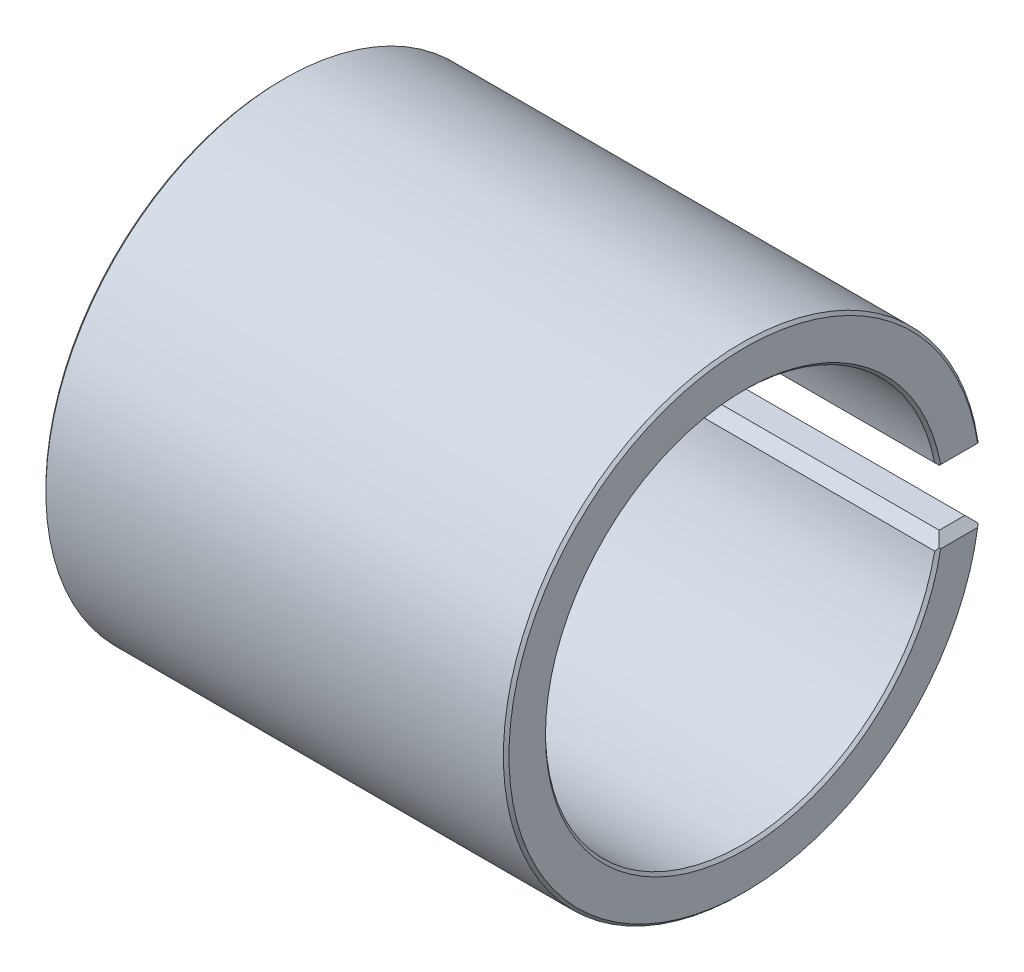
ISO-10303-21;
HEADER;
FILE_DESCRIPTION(('STEP AP214'),'2;1');
FILE_NAME('part.step','',(''),(''),'','','');
FILE_SCHEMA(('AUTOMOTIVE_DESIGN { 1 0 10303 214 1 1 1 1 }'));
ENDSEC;
DATA;
#1=APPLICATION_CONTEXT('core data for automotive mechanical design processes');
#2=APPLICATION_PROTOCOL_DEFINITION('international standard','automotive_design',2000,#1);
#3=PRODUCT_CONTEXT('',#1,'mechanical');
#4=PRODUCT('Part','Part','',(#3));
#5=PRODUCT_RELATED_PRODUCT_CATEGORY('part','',(#4));
#6=PRODUCT_DEFINITION_FORMATION('','',#4);
#7=PRODUCT_DEFINITION_CONTEXT('part definition',#1,'design');
#8=PRODUCT_DEFINITION('design','',#6,#7);
#9=PRODUCT_DEFINITION_SHAPE('','',#8);
#10=(LENGTH_UNIT() NAMED_UNIT(*) SI_UNIT(.MILLI.,.METRE.));
#11=(NAMED_UNIT(*) PLANE_ANGLE_UNIT() SI_UNIT($,.RADIAN.));
#12=(NAMED_UNIT(*) SI_UNIT($,.STERADIAN.) SOLID_ANGLE_UNIT());
#13=UNCERTAINTY_MEASURE_WITH_UNIT(LENGTH_MEASURE(1.E-05),#10,'distance_accuracy_value','');
#14=(GEOMETRIC_REPRESENTATION_CONTEXT(3) GLOBAL_UNCERTAINTY_ASSIGNED_CONTEXT((#13)) GLOBAL_UNIT_ASSIGNED_CONTEXT((#10,
#11,#12)) REPRESENTATION_CONTEXT('',''));
#15=CARTESIAN_POINT('',(0.,0.,0.));
#16=DIRECTION('',(0.,0.,1.));
#17=DIRECTION('',(1.,0.,0.));
#18=AXIS2_PLACEMENT_3D('',#15,#16,#17);
#19=CARTESIAN_POINT('',(-8.25,7.,0.));
#20=DIRECTION('',(1.,0.,0.));
#21=DIRECTION('',(0.,0.,-1.));
#22=AXIS2_PLACEMENT_3D('',#19,#20,#21);
#23=PLANE('',#22);
#24=CARTESIAN_POINT('',(-8.25,0.,0.));
#25=DIRECTION('',(1.,0.,0.));
#26=DIRECTION('',(0.,0.,-1.));
#27=AXIS2_PLACEMENT_3D('',#24,#25,#26);
#28=CIRCLE('',#27,8.4);
#29=CARTESIAN_POINT('',(-8.25,-1.3,-8.29879509326504));
#30=VERTEX_POINT('',#29);
#31=CARTESIAN_POINT('',(-8.25,1.3,-8.29879509326504));
#32=VERTEX_POINT('',#31);
#33=EDGE_CURVE('E435',#30,#32,#28,.F.);
#34=ORIENTED_EDGE('',*,*,#33,.T.);
#35=DIRECTION('',(0.,0.,1.));
#36=VECTOR('',#35,1.);
#37=CARTESIAN_POINT('',(-8.25,1.3,0.));
#38=LINE('',#37,#36);
#39=CARTESIAN_POINT('',(-8.25,1.3,-6.97997134664607));
#40=VERTEX_POINT('',#39);
#41=EDGE_CURVE('E11',#32,#40,#38,.T.);
#42=ORIENTED_EDGE('',*,*,#41,.T.);
#43=CARTESIAN_POINT('',(-8.25,0.,0.));
#44=DIRECTION('',(1.,0.,0.));
#45=DIRECTION('',(0.,0.,-1.));
#46=AXIS2_PLACEMENT_3D('',#43,#44,#45);
#47=CIRCLE('',#46,7.10000000000001);
#48=CARTESIAN_POINT('',(-8.25,-1.3,-6.97997134664607));
#49=VERTEX_POINT('',#48);
#50=EDGE_CURVE('E382',#40,#49,#47,.T.);
#51=ORIENTED_EDGE('',*,*,#50,.T.);
#52=DIRECTION('',(0.,0.,-1.));
#53=VECTOR('',#52,1.);
#54=CARTESIAN_POINT('',(-8.25,-1.3,0.));
#55=LINE('',#54,#53);
#56=EDGE_CURVE('E56',#49,#30,#55,.T.);
#57=ORIENTED_EDGE('',*,*,#56,.T.);
#58=EDGE_LOOP('',(#34,#42,#51,#57));
#59=FACE_BOUND('',#58,.T.);
#60=ADVANCED_FACE('F45',(#59),#23,.F.);
#61=CARTESIAN_POINT('',(0.,0.,0.));
#62=DIRECTION('',(-1.,0.,0.));
#63=DIRECTION('',(0.,0.,1.));
#64=AXIS2_PLACEMENT_3D('',#61,#62,#63);
#65=CYLINDRICAL_SURFACE('',#64,8.5);
#66=CARTESIAN_POINT('',(-8.15,0.,0.));
#67=DIRECTION('',(1.,0.,0.));
#68=DIRECTION('',(0.,0.,-1.));
#69=AXIS2_PLACEMENT_3D('',#66,#67,#68);
#70=CIRCLE('',#69,8.5);
#71=CARTESIAN_POINT('',(-8.15,1.26445286814602,-8.40542437621309));
#72=VERTEX_POINT('',#71);
#73=CARTESIAN_POINT('',(-8.15,-1.26445286814602,-8.40542437621309));
#74=VERTEX_POINT('',#73);
#75=EDGE_CURVE('E191',#72,#74,#70,.T.);
#76=ORIENTED_EDGE('',*,*,#75,.T.);
#77=DIRECTION('',(-1.,0.,0.));
#78=VECTOR('',#77,1.);
#79=CARTESIAN_POINT('',(0.,-1.26445286814602,-8.40542437621309));
#80=LINE('',#79,#78);
#81=CARTESIAN_POINT('',(8.15,-1.26445286814602,-8.40542437621309));
#82=VERTEX_POINT('',#81);
#83=EDGE_CURVE('E250',#74,#82,#80,.F.);
#84=ORIENTED_EDGE('',*,*,#83,.T.);
#85=CARTESIAN_POINT('',(8.15,0.,0.));
#86=DIRECTION('',(-1.,0.,0.));
#87=DIRECTION('',(0.,0.,1.));
#88=AXIS2_PLACEMENT_3D('',#85,#86,#87);
#89=CIRCLE('',#88,8.5);
#90=CARTESIAN_POINT('',(8.15,1.26445286814602,-8.40542437621309));
#91=VERTEX_POINT('',#90);
#92=EDGE_CURVE('E196',#82,#91,#89,.T.);
#93=ORIENTED_EDGE('',*,*,#92,.T.);
#94=DIRECTION('',(-1.,0.,0.));
#95=VECTOR('',#94,1.);
#96=CARTESIAN_POINT('',(0.,1.26445286814602,-8.40542437621309));
#97=LINE('',#96,#95);
#98=EDGE_CURVE('E399',#91,#72,#97,.T.);
#99=ORIENTED_EDGE('',*,*,#98,.T.);
#100=EDGE_LOOP('',(#76,#84,#93,#99));
#101=FACE_BOUND('',#100,.T.);
#102=ADVANCED_FACE('F431',(#101),#65,.T.);
#103=CARTESIAN_POINT('',(8.25,8.5,0.));
#104=DIRECTION('',(-1.,0.,0.));
#105=DIRECTION('',(0.,0.,1.));
#106=AXIS2_PLACEMENT_3D('',#103,#104,#105);
#107=PLANE('',#106);
#108=CARTESIAN_POINT('',(8.25,0.,0.));
#109=DIRECTION('',(-1.,0.,0.));
#110=DIRECTION('',(0.,0.,1.));
#111=AXIS2_PLACEMENT_3D('',#108,#109,#110);
#112=CIRCLE('',#111,7.1);
#113=CARTESIAN_POINT('',(8.25,-1.3,-6.97997134664606));
#114=VERTEX_POINT('',#113);
#115=CARTESIAN_POINT('',(8.25,1.3,-6.97997134664606));
#116=VERTEX_POINT('',#115);
#117=EDGE_CURVE('E186',#114,#116,#112,.T.);
#118=ORIENTED_EDGE('',*,*,#117,.T.);
#119=DIRECTION('',(0.,0.,-1.));
#120=VECTOR('',#119,1.);
#121=CARTESIAN_POINT('',(8.25,1.3,0.));
#122=LINE('',#121,#120);
#123=CARTESIAN_POINT('',(8.25,1.3,-8.29879509326505));
#124=VERTEX_POINT('',#123);
#125=EDGE_CURVE('E403',#116,#124,#122,.T.);
#126=ORIENTED_EDGE('',*,*,#125,.T.);
#127=CARTESIAN_POINT('',(8.25,0.,0.));
#128=DIRECTION('',(-1.,0.,0.));
#129=DIRECTION('',(0.,0.,1.));
#130=AXIS2_PLACEMENT_3D('',#127,#128,#129);
#131=CIRCLE('',#130,8.4);
#132=CARTESIAN_POINT('',(8.25,-1.3,-8.29879509326505));
#133=VERTEX_POINT('',#132);
#134=EDGE_CURVE('E193',#124,#133,#131,.F.);
#135=ORIENTED_EDGE('',*,*,#134,.T.);
#136=DIRECTION('',(0.,0.,1.));
#137=VECTOR('',#136,1.);
#138=CARTESIAN_POINT('',(8.25,-1.3,0.));
#139=LINE('',#138,#137);
#140=EDGE_CURVE('E407',#133,#114,#139,.T.);
#141=ORIENTED_EDGE('',*,*,#140,.T.);
#142=EDGE_LOOP('',(#118,#126,#135,#141));
#143=FACE_BOUND('',#142,.T.);
#144=ADVANCED_FACE('F441',(#143),#107,.F.);
#145=CARTESIAN_POINT('',(0.,0.,0.));
#146=DIRECTION('',(-1.,0.,0.));
#147=DIRECTION('',(0.,0.,1.));
#148=AXIS2_PLACEMENT_3D('',#145,#146,#147);
#149=CYLINDRICAL_SURFACE('',#148,7.);
#150=CARTESIAN_POINT('',(8.15,0.,0.));
#151=DIRECTION('',(-1.,0.,0.));
#152=DIRECTION('',(0.,0.,1.));
#153=AXIS2_PLACEMENT_3D('',#150,#151,#152);
#154=CIRCLE('',#153,7.);
#155=CARTESIAN_POINT('',(8.15,1.3619809963565,-6.86622223391901));
#156=VERTEX_POINT('',#155);
#157=CARTESIAN_POINT('',(8.15,-1.3619809963565,-6.86622223391901));
#158=VERTEX_POINT('',#157);
#159=EDGE_CURVE('E181',#156,#158,#154,.F.);
#160=ORIENTED_EDGE('',*,*,#159,.T.);
#161=DIRECTION('',(-1.,0.,0.));
#162=VECTOR('',#161,1.);
#163=CARTESIAN_POINT('',(0.,-1.3619809963565,-6.86622223391901));
#164=LINE('',#163,#162);
#165=CARTESIAN_POINT('',(-8.15,-1.3619809963565,-6.86622223391901));
#166=VERTEX_POINT('',#165);
#167=EDGE_CURVE('E185',#158,#166,#164,.T.);
#168=ORIENTED_EDGE('',*,*,#167,.T.);
#169=CARTESIAN_POINT('',(-8.15,0.,0.));
#170=DIRECTION('',(1.,0.,0.));
#171=DIRECTION('',(0.,0.,-1.));
#172=AXIS2_PLACEMENT_3D('',#169,#170,#171);
#173=CIRCLE('',#172,7.);
#174=CARTESIAN_POINT('',(-8.15,1.3619809963565,-6.86622223391901));
#175=VERTEX_POINT('',#174);
#176=EDGE_CURVE('E184',#166,#175,#173,.F.);
#177=ORIENTED_EDGE('',*,*,#176,.T.);
#178=DIRECTION('',(-1.,0.,0.));
#179=VECTOR('',#178,1.);
#180=CARTESIAN_POINT('',(0.,1.3619809963565,-6.86622223391901));
#181=LINE('',#180,#179);
#182=EDGE_CURVE('E166',#175,#156,#181,.F.);
#183=ORIENTED_EDGE('',*,*,#182,.T.);
#184=EDGE_LOOP('',(#160,#168,#177,#183));
#185=FACE_BOUND('',#184,.T.);
#186=ADVANCED_FACE('F179',(#185),#149,.F.);
#187=CARTESIAN_POINT('',(-8.25,0.,0.));
#188=DIRECTION('',(1.,0.,0.));
#189=DIRECTION('',(0.,0.,-1.));
#190=AXIS2_PLACEMENT_3D('',#187,#188,#189);
#191=CONICAL_SURFACE('',#190,8.4,0.785398163397457);
#192=ORIENTED_EDGE('',*,*,#75,.F.);
#193=CARTESIAN_POINT('',(-8.15,1.26445286814602,-8.40542437621309));
#194=CARTESIAN_POINT('',(-8.1667000097545,1.2497735971975,-8.39074510526457));
#195=CARTESIAN_POINT('',(-8.18338334793342,1.23508487406916,-8.37605638213623));
#196=CARTESIAN_POINT('',(-8.21671668126701,1.20568852334098,-8.34666003140805));
#197=CARTESIAN_POINT('',(-8.23336667642142,1.19098089574098,-8.33195240380805));
#198=CARTESIAN_POINT('',(-8.25,1.17626381596103,-8.3172353240281));
#199=B_SPLINE_CURVE_WITH_KNOTS('',3,(#193,#194,#195,#196,#197,#198),.UNSPECIFIED.,.F.,.F.,(4,2,
4),(0.,0.0799290843414844,0.159858169291451),.UNSPECIFIED.);
#200=CARTESIAN_POINT('',(-8.18428360096254,1.23428360096254,-8.37525510902961));
#201=VERTEX_POINT('',#200);
#202=EDGE_CURVE('E64',#72,#201,#199,.T.);
#203=ORIENTED_EDGE('',*,*,#202,.T.);
#204=CARTESIAN_POINT('',(-8.15,1.2,-8.41486779456457));
#205=CARTESIAN_POINT('',(-8.16671325425253,1.21671325425253,-8.39560261828659));
#206=CARTESIAN_POINT('',(-8.18340321456955,1.23340321456955,-8.37629730520597));
#207=CARTESIAN_POINT('',(-8.21673654790448,1.26673654790448,-8.33760640477555));
#208=CARTESIAN_POINT('',(-8.2333799209208,1.2833799209208,-8.318220817423));
#209=CARTESIAN_POINT('',(-8.25,1.3,-8.29879509326504));
#210=B_SPLINE_CURVE_WITH_KNOTS('',3,(#204,#205,#206,#207,#208,#209),.UNSPECIFIED.,.F.,.F.,(4,2,
4),(0.,0.0914780956031036,0.182956194345469),.UNSPECIFIED.);
#211=EDGE_CURVE('E274',#201,#32,#210,.T.);
#212=ORIENTED_EDGE('',*,*,#211,.T.);
#213=ORIENTED_EDGE('',*,*,#33,.F.);
#214=CARTESIAN_POINT('',(-8.25,-1.3,-8.29879509326504));
#215=CARTESIAN_POINT('',(-8.2333799209208,-1.2833799209208,-8.318220817423));
#216=CARTESIAN_POINT('',(-8.21673654790448,-1.26673654790448,-8.33760640477555));
#217=CARTESIAN_POINT('',(-8.18340321456955,-1.23340321456954,-8.37629730520597));
#218=CARTESIAN_POINT('',(-8.16671325425253,-1.21671325425253,-8.39560261828659));
#219=CARTESIAN_POINT('',(-8.15,-1.2,-8.41486779456457));
#220=B_SPLINE_CURVE_WITH_KNOTS('',3,(#214,#215,#216,#217,#218,#219),.UNSPECIFIED.,.F.,.F.,(4,2,
4),(0.,0.0914780987423646,0.182956194345468),.UNSPECIFIED.);
#221=CARTESIAN_POINT('',(-8.18428360096254,-1.23428360096254,-8.37525510902961));
#222=VERTEX_POINT('',#221);
#223=EDGE_CURVE('E71',#30,#222,#220,.T.);
#224=ORIENTED_EDGE('',*,*,#223,.T.);
#225=CARTESIAN_POINT('',(-8.25,-1.17626381596103,-8.3172353240281));
#226=CARTESIAN_POINT('',(-8.23336667642142,-1.19098089574098,-8.33195240380805));
#227=CARTESIAN_POINT('',(-8.21671668126701,-1.20568852334097,-8.34666003140804));
#228=CARTESIAN_POINT('',(-8.18338334793342,-1.23508487406916,-8.37605638213623));
#229=CARTESIAN_POINT('',(-8.1667000097545,-1.2497735971975,-8.39074510526457));
#230=CARTESIAN_POINT('',(-8.15,-1.26445286814602,-8.40542437621309));
#231=B_SPLINE_CURVE_WITH_KNOTS('',3,(#225,#226,#227,#228,#229,#230),.UNSPECIFIED.,.F.,.F.,(4,2,
4),(0.,0.0799290849499674,0.159858169291453),.UNSPECIFIED.);
#232=EDGE_CURVE('E249',#222,#74,#231,.T.);
#233=ORIENTED_EDGE('',*,*,#232,.T.);
#234=EDGE_LOOP('',(#192,#203,#212,#213,#224,#233));
#235=FACE_BOUND('',#234,.T.);
#236=ADVANCED_FACE('F258',(#235),#191,.T.);
#237=CARTESIAN_POINT('',(-8.15,0.,0.));
#238=DIRECTION('',(-1.,0.,0.));
#239=DIRECTION('',(0.,0.,1.));
#240=AXIS2_PLACEMENT_3D('',#237,#238,#239);
#241=CONICAL_SURFACE('',#240,7.,0.78539816339747);
#242=CARTESIAN_POINT('',(-8.25,1.3,-6.97997134664607));
#243=CARTESIAN_POINT('',(-8.23330733513689,1.28330733513689,-6.96610096617401));
#244=CARTESIAN_POINT('',(-8.21662766947473,1.26662766947473,-6.9521994854561));
#245=CARTESIAN_POINT('',(-8.18329433614076,1.23329433614076,-6.9243343231845));
#246=CARTESIAN_POINT('',(-8.16664066846958,1.21664066846958,-6.91037064162928));
#247=CARTESIAN_POINT('',(-8.15,1.2,-6.89637585982667));
#248=B_SPLINE_CURVE_WITH_KNOTS('',3,(#242,#243,#244,#245,#246,#247),.UNSPECIFIED.,.F.,.F.,(4,2,
4),(0.,0.082140507267581,0.164281016563663),.UNSPECIFIED.);
#249=CARTESIAN_POINT('',(-8.22174770880733,1.27174770880733,-6.95645552146818));
#250=VERTEX_POINT('',#249);
#251=EDGE_CURVE('E292',#40,#250,#248,.T.);
#252=ORIENTED_EDGE('',*,*,#251,.T.);
#253=CARTESIAN_POINT('',(-8.25,1.23674729209706,-6.99145593817845));
#254=CARTESIAN_POINT('',(-8.23314182203366,1.25754311252099,-6.97066011775452));
#255=CARTESIAN_POINT('',(-8.216379400332,1.27837716397278,-6.94982606630273));
#256=CARTESIAN_POINT('',(-8.18304606697007,1.32012173204784,-6.90808149822766));
#257=CARTESIAN_POINT('',(-8.1664751553384,1.34103224868253,-6.88717098159298));
#258=CARTESIAN_POINT('',(-8.15,1.3619809963565,-6.86622223391901));
#259=B_SPLINE_CURVE_WITH_KNOTS('',3,(#253,#254,#255,#256,#257,#258),.UNSPECIFIED.,.F.,.F.,(4,2,
4),(0.,0.101694875140613,0.20338976546198),.UNSPECIFIED.);
#260=EDGE_CURVE('E298',#250,#175,#259,.T.);
#261=ORIENTED_EDGE('',*,*,#260,.T.);
#262=ORIENTED_EDGE('',*,*,#176,.F.);
#263=CARTESIAN_POINT('',(-8.15,-1.3619809963565,-6.86622223391901));
#264=CARTESIAN_POINT('',(-8.1664751553384,-1.34103224868253,-6.88717098159298));
#265=CARTESIAN_POINT('',(-8.18304606697007,-1.32012173204784,-6.90808149822766));
#266=CARTESIAN_POINT('',(-8.216379400332,-1.27837716397278,-6.94982606630273));
#267=CARTESIAN_POINT('',(-8.23314182203366,-1.25754311252099,-6.97066011775452));
#268=CARTESIAN_POINT('',(-8.25,-1.23674729209706,-6.99145593817845));
#269=B_SPLINE_CURVE_WITH_KNOTS('',3,(#263,#264,#265,#266,#267,#268),.UNSPECIFIED.,.F.,.F.,(4,2,
4),(0.,0.101694890321367,0.20338976546198),.UNSPECIFIED.);
#270=CARTESIAN_POINT('',(-8.22174770880733,-1.27174770880733,-6.95645552146818));
#271=VERTEX_POINT('',#270);
#272=EDGE_CURVE('E213',#166,#271,#269,.T.);
#273=ORIENTED_EDGE('',*,*,#272,.T.);
#274=CARTESIAN_POINT('',(-8.15,-1.2,-6.89637585982667));
#275=CARTESIAN_POINT('',(-8.16664066846958,-1.21664066846958,-6.91037064162928));
#276=CARTESIAN_POINT('',(-8.18329433614076,-1.23329433614076,-6.9243343231845));
#277=CARTESIAN_POINT('',(-8.21662766947473,-1.26662766947473,-6.9521994854561));
#278=CARTESIAN_POINT('',(-8.23330733513689,-1.28330733513689,-6.96610096617401));
#279=CARTESIAN_POINT('',(-8.25,-1.3,-6.97997134664607));
#280=B_SPLINE_CURVE_WITH_KNOTS('',3,(#274,#275,#276,#277,#278,#279),.UNSPECIFIED.,.F.,.F.,(4,2,
4),(0.,0.0821405092960821,0.164281016563663),.UNSPECIFIED.);
#281=EDGE_CURVE('E205',#271,#49,#280,.T.);
#282=ORIENTED_EDGE('',*,*,#281,.T.);
#283=ORIENTED_EDGE('',*,*,#50,.F.);
#284=EDGE_LOOP('',(#252,#261,#262,#273,#282,#283));
#285=FACE_BOUND('',#284,.T.);
#286=ADVANCED_FACE('F221',(#285),#241,.F.);
#287=CARTESIAN_POINT('',(8.25,0.,0.));
#288=DIRECTION('',(1.,0.,0.));
#289=DIRECTION('',(0.,0.,-1.));
#290=AXIS2_PLACEMENT_3D('',#287,#288,#289);
#291=CONICAL_SURFACE('',#290,7.1,0.785398163397457);
#292=ORIENTED_EDGE('',*,*,#159,.F.);
#293=CARTESIAN_POINT('',(8.15,1.3619809963565,-6.86622223391901));
#294=CARTESIAN_POINT('',(8.1664751553384,1.34103224868253,-6.88717098159298));
#295=CARTESIAN_POINT('',(8.18304606697007,1.32012173204785,-6.90808149822766));
#296=CARTESIAN_POINT('',(8.216379400332,1.27837716397278,-6.94982606630273));
#297=CARTESIAN_POINT('',(8.23314182203366,1.25754311252099,-6.97066011775452));
#298=CARTESIAN_POINT('',(8.25,1.23674729209706,-6.99145593817845));
#299=B_SPLINE_CURVE_WITH_KNOTS('',3,(#293,#294,#295,#296,#297,#298),.UNSPECIFIED.,.F.,.F.,(4,2,
4),(0.,0.101694890321363,0.203389765461973),.UNSPECIFIED.);
#300=CARTESIAN_POINT('',(8.22174770880733,1.27174770880733,-6.95645552146818));
#301=VERTEX_POINT('',#300);
#302=EDGE_CURVE('E162',#156,#301,#299,.T.);
#303=ORIENTED_EDGE('',*,*,#302,.T.);
#304=CARTESIAN_POINT('',(8.15,1.2,-6.89637585982667));
#305=CARTESIAN_POINT('',(8.16664066846958,1.21664066846958,-6.91037064162928));
#306=CARTESIAN_POINT('',(8.18329433614076,1.23329433614076,-6.9243343231845));
#307=CARTESIAN_POINT('',(8.21662766947473,1.26662766947473,-6.95219948545609));
#308=CARTESIAN_POINT('',(8.23330733513689,1.28330733513689,-6.966100966174));
#309=CARTESIAN_POINT('',(8.25,1.3,-6.97997134664606));
#310=B_SPLINE_CURVE_WITH_KNOTS('',3,(#304,#305,#306,#307,#308,#309),.UNSPECIFIED.,.F.,.F.,(4,2,
4),(0.,0.0821405092960786,0.164281016563658),.UNSPECIFIED.);
#311=EDGE_CURVE('E174',#301,#116,#310,.T.);
#312=ORIENTED_EDGE('',*,*,#311,.T.);
#313=ORIENTED_EDGE('',*,*,#117,.F.);
#314=CARTESIAN_POINT('',(8.25,-1.3,-6.97997134664606));
#315=CARTESIAN_POINT('',(8.23330733513689,-1.28330733513689,-6.966100966174));
#316=CARTESIAN_POINT('',(8.21662766947474,-1.26662766947473,-6.95219948545609));
#317=CARTESIAN_POINT('',(8.18329433614076,-1.23329433614076,-6.9243343231845));
#318=CARTESIAN_POINT('',(8.16664066846958,-1.21664066846958,-6.91037064162928));
#319=CARTESIAN_POINT('',(8.15,-1.2,-6.89637585982667));
#320=B_SPLINE_CURVE_WITH_KNOTS('',3,(#314,#315,#316,#317,#318,#319),.UNSPECIFIED.,.F.,.F.,(4,2,
4),(0.,0.082140507267578,0.164281016563658),.UNSPECIFIED.);
#321=CARTESIAN_POINT('',(8.22174770880733,-1.27174770880733,-6.95645552146818));
#322=VERTEX_POINT('',#321);
#323=EDGE_CURVE('E339',#114,#322,#320,.T.);
#324=ORIENTED_EDGE('',*,*,#323,.T.);
#325=CARTESIAN_POINT('',(8.25,-1.23674729209706,-6.99145593817845));
#326=CARTESIAN_POINT('',(8.23314182203366,-1.25754311252099,-6.97066011775452));
#327=CARTESIAN_POINT('',(8.216379400332,-1.27837716397278,-6.94982606630273));
#328=CARTESIAN_POINT('',(8.18304606697007,-1.32012173204785,-6.90808149822766));
#329=CARTESIAN_POINT('',(8.1664751553384,-1.34103224868253,-6.88717098159298));
#330=CARTESIAN_POINT('',(8.15,-1.3619809963565,-6.86622223391901));
#331=B_SPLINE_CURVE_WITH_KNOTS('',3,(#325,#326,#327,#328,#329,#330),.UNSPECIFIED.,.F.,.F.,(4,2,
4),(0.,0.10169487514061,0.203389765461973),.UNSPECIFIED.);
#332=EDGE_CURVE('E190',#322,#158,#331,.T.);
#333=ORIENTED_EDGE('',*,*,#332,.T.);
#334=EDGE_LOOP('',(#292,#303,#312,#313,#324,#333));
#335=FACE_BOUND('',#334,.T.);
#336=ADVANCED_FACE('F188',(#335),#291,.F.);
#337=CARTESIAN_POINT('',(8.15,0.,0.));
#338=DIRECTION('',(-1.,0.,0.));
#339=DIRECTION('',(0.,0.,1.));
#340=AXIS2_PLACEMENT_3D('',#337,#338,#339);
#341=CONICAL_SURFACE('',#340,8.5,0.785398163397457);
#342=CARTESIAN_POINT('',(8.15,-1.26445286814602,-8.40542437621309));
#343=CARTESIAN_POINT('',(8.1667000097545,-1.2497735971975,-8.39074510526457));
#344=CARTESIAN_POINT('',(8.18338334793343,-1.23508487406916,-8.37605638213623));
#345=CARTESIAN_POINT('',(8.21671668126701,-1.20568852334098,-8.34666003140805));
#346=CARTESIAN_POINT('',(8.23336667642142,-1.19098089574098,-8.33195240380805));
#347=CARTESIAN_POINT('',(8.25,-1.17626381596103,-8.3172353240281));
#348=B_SPLINE_CURVE_WITH_KNOTS('',3,(#342,#343,#344,#345,#346,#347),.UNSPECIFIED.,.F.,.F.,(4,2,
4),(0.,0.079929084341483,0.159858169291448),.UNSPECIFIED.);
#349=CARTESIAN_POINT('',(8.18428360096255,-1.23428360096254,-8.37525510902961));
#350=VERTEX_POINT('',#349);
#351=EDGE_CURVE('E405',#82,#350,#348,.T.);
#352=ORIENTED_EDGE('',*,*,#351,.T.);
#353=CARTESIAN_POINT('',(8.15,-1.2,-8.41486779456457));
#354=CARTESIAN_POINT('',(8.16671325425254,-1.21671325425253,-8.39560261828659));
#355=CARTESIAN_POINT('',(8.18340321456955,-1.23340321456955,-8.37629730520597));
#356=CARTESIAN_POINT('',(8.21673654790448,-1.26673654790448,-8.33760640477555));
#357=CARTESIAN_POINT('',(8.2333799209208,-1.2833799209208,-8.318220817423));
#358=CARTESIAN_POINT('',(8.25,-1.3,-8.29879509326505));
#359=B_SPLINE_CURVE_WITH_KNOTS('',3,(#353,#354,#355,#356,#357,#358),.UNSPECIFIED.,.F.,.F.,(4,2,
4),(0.,0.0914780956031004,0.182956194345461),.UNSPECIFIED.);
#360=EDGE_CURVE('E424',#350,#133,#359,.T.);
#361=ORIENTED_EDGE('',*,*,#360,.T.);
#362=ORIENTED_EDGE('',*,*,#134,.F.);
#363=CARTESIAN_POINT('',(8.25,1.3,-8.29879509326505));
#364=CARTESIAN_POINT('',(8.2333799209208,1.2833799209208,-8.318220817423));
#365=CARTESIAN_POINT('',(8.21673654790448,1.26673654790448,-8.33760640477555));
#366=CARTESIAN_POINT('',(8.18340321456955,1.23340321456955,-8.37629730520597));
#367=CARTESIAN_POINT('',(8.16671325425254,1.21671325425254,-8.39560261828659));
#368=CARTESIAN_POINT('',(8.15,1.2,-8.41486779456457));
#369=B_SPLINE_CURVE_WITH_KNOTS('',3,(#363,#364,#365,#366,#367,#368),.UNSPECIFIED.,.F.,.F.,(4,2,
4),(0.,0.0914780987423613,0.182956194345462),.UNSPECIFIED.);
#370=CARTESIAN_POINT('',(8.18428360096254,1.23428360096254,-8.37525510902961));
#371=VERTEX_POINT('',#370);
#372=EDGE_CURVE('E391',#124,#371,#369,.T.);
#373=ORIENTED_EDGE('',*,*,#372,.T.);
#374=CARTESIAN_POINT('',(8.25,1.17626381596103,-8.3172353240281));
#375=CARTESIAN_POINT('',(8.23336667642142,1.19098089574098,-8.33195240380805));
#376=CARTESIAN_POINT('',(8.21671668126701,1.20568852334098,-8.34666003140805));
#377=CARTESIAN_POINT('',(8.18338334793343,1.23508487406916,-8.37605638213623));
#378=CARTESIAN_POINT('',(8.1667000097545,1.2497735971975,-8.39074510526457));
#379=CARTESIAN_POINT('',(8.15,1.26445286814602,-8.40542437621309));
#380=B_SPLINE_CURVE_WITH_KNOTS('',3,(#374,#375,#376,#377,#378,#379),.UNSPECIFIED.,.F.,.F.,(4,2,
4),(0.,0.0799290849499654,0.159858169291448),.UNSPECIFIED.);
#381=EDGE_CURVE('E398',#371,#91,#380,.T.);
#382=ORIENTED_EDGE('',*,*,#381,.T.);
#383=ORIENTED_EDGE('',*,*,#92,.F.);
#384=EDGE_LOOP('',(#352,#361,#362,#373,#382,#383));
#385=FACE_BOUND('',#384,.T.);
#386=ADVANCED_FACE('F333',(#385),#341,.T.);
#387=CARTESIAN_POINT('',(-21.9531820075645,1.,-8.5));
#388=DIRECTION('',(0.,1.,0.));
#389=DIRECTION('',(0.,0.,1.));
#390=AXIS2_PLACEMENT_3D('',#387,#388,#389);
#391=PLANE('',#390);
#392=DIRECTION('',(0.,0.,1.));
#393=VECTOR('',#392,1.);
#394=CARTESIAN_POINT('',(7.95,1.,-8.5));
#395=LINE('',#394,#393);
#396=CARTESIAN_POINT('',(7.95,1.,-8.14097150806707));
#397=VERTEX_POINT('',#396);
#398=CARTESIAN_POINT('',(7.95,1.,-7.22820323027551));
#399=VERTEX_POINT('',#398);
#400=EDGE_CURVE('E392',#397,#399,#395,.T.);
#401=ORIENTED_EDGE('',*,*,#400,.T.);
#402=DIRECTION('',(-1.,0.,0.));
#403=VECTOR('',#402,1.);
#404=CARTESIAN_POINT('',(-21.9531820075645,1.,-7.22820323027551));
#405=LINE('',#404,#403);
#406=CARTESIAN_POINT('',(-7.95,1.,-7.22820323027551));
#407=VERTEX_POINT('',#406);
#408=EDGE_CURVE('E448',#399,#407,#405,.T.);
#409=ORIENTED_EDGE('',*,*,#408,.T.);
#410=DIRECTION('',(0.,0.,-1.));
#411=VECTOR('',#410,1.);
#412=CARTESIAN_POINT('',(-7.95,1.,-8.5));
#413=LINE('',#412,#411);
#414=CARTESIAN_POINT('',(-7.95,1.,-8.14097150806707));
#415=VERTEX_POINT('',#414);
#416=EDGE_CURVE('E173',#407,#415,#413,.T.);
#417=ORIENTED_EDGE('',*,*,#416,.T.);
#418=DIRECTION('',(1.,0.,0.));
#419=VECTOR('',#418,1.);
#420=CARTESIAN_POINT('',(-21.9531820075645,1.,-8.14097150806707));
#421=LINE('',#420,#419);
#422=EDGE_CURVE('E396',#415,#397,#421,.T.);
#423=ORIENTED_EDGE('',*,*,#422,.T.);
#424=EDGE_LOOP('',(#401,#409,#417,#423));
#425=FACE_BOUND('',#424,.T.);
#426=ADVANCED_FACE('F451',(#425),#391,.F.);
#427=CARTESIAN_POINT('',(-21.9531820075645,-1.,-8.5));
#428=DIRECTION('',(0.,-1.,0.));
#429=DIRECTION('',(0.,0.,-1.));
#430=AXIS2_PLACEMENT_3D('',#427,#428,#429);
#431=PLANE('',#430);
#432=DIRECTION('',(0.,0.,1.));
#433=VECTOR('',#432,1.);
#434=CARTESIAN_POINT('',(-7.95,-1.,-8.5));
#435=LINE('',#434,#433);
#436=CARTESIAN_POINT('',(-7.95,-1.,-8.14097150806707));
#437=VERTEX_POINT('',#436);
#438=CARTESIAN_POINT('',(-7.95,-1.,-7.22820323027551));
#439=VERTEX_POINT('',#438);
#440=EDGE_CURVE('E304',#437,#439,#435,.T.);
#441=ORIENTED_EDGE('',*,*,#440,.T.);
#442=DIRECTION('',(1.,0.,0.));
#443=VECTOR('',#442,1.);
#444=CARTESIAN_POINT('',(-21.9531820075645,-1.,-7.22820323027551));
#445=LINE('',#444,#443);
#446=CARTESIAN_POINT('',(7.95,-1.,-7.22820323027551));
#447=VERTEX_POINT('',#446);
#448=EDGE_CURVE('E349',#439,#447,#445,.T.);
#449=ORIENTED_EDGE('',*,*,#448,.T.);
#450=DIRECTION('',(0.,0.,-1.));
#451=VECTOR('',#450,1.);
#452=CARTESIAN_POINT('',(7.95,-1.,-8.5));
#453=LINE('',#452,#451);
#454=CARTESIAN_POINT('',(7.95,-1.,-8.14097150806707));
#455=VERTEX_POINT('',#454);
#456=EDGE_CURVE('E354',#447,#455,#453,.T.);
#457=ORIENTED_EDGE('',*,*,#456,.T.);
#458=DIRECTION('',(-1.,0.,0.));
#459=VECTOR('',#458,1.);
#460=CARTESIAN_POINT('',(-21.9531820075645,-1.,-8.14097150806707));
#461=LINE('',#460,#459);
#462=EDGE_CURVE('E357',#455,#437,#461,.T.);
#463=ORIENTED_EDGE('',*,*,#462,.T.);
#464=EDGE_LOOP('',(#441,#449,#457,#463));
#465=FACE_BOUND('',#464,.T.);
#466=ADVANCED_FACE('F362',(#465),#431,.F.);
#467=CARTESIAN_POINT('',(0.,-1.26445286814602,-8.40542437621309));
#468=DIRECTION('',(0.,0.707106781186553,-0.707106781186542));
#469=DIRECTION('',(-1.,0.,0.));
#470=AXIS2_PLACEMENT_3D('',#467,#468,#469);
#471=PLANE('',#470);
#472=DIRECTION('',(0.577350269189627,0.57735026918962,0.57735026918963));
#473=VECTOR('',#472,1.);
#474=CARTESIAN_POINT('',(-5.43634283064428,1.51365716935569,-5.62731433871134));
#475=LINE('',#474,#473);
#476=EDGE_CURVE('E373',#437,#222,#475,.F.);
#477=ORIENTED_EDGE('',*,*,#476,.F.);
#478=ORIENTED_EDGE('',*,*,#462,.F.);
#479=DIRECTION('',(-0.577350269189628,0.57735026918962,0.577350269189629));
#480=VECTOR('',#479,1.);
#481=CARTESIAN_POINT('',(5.47630191209733,1.47369808790263,-5.66727342016439));
#482=LINE('',#481,#480);
#483=EDGE_CURVE('E379',#350,#455,#482,.T.);
#484=ORIENTED_EDGE('',*,*,#483,.F.);
#485=ORIENTED_EDGE('',*,*,#351,.F.);
#486=ORIENTED_EDGE('',*,*,#83,.F.);
#487=ORIENTED_EDGE('',*,*,#232,.F.);
#488=EDGE_LOOP('',(#477,#478,#484,#485,#486,#487));
#489=FACE_BOUND('',#488,.T.);
#490=ADVANCED_FACE('F312',(#489),#471,.T.);
#491=CARTESIAN_POINT('',(8.25,-1.3,0.));
#492=DIRECTION('',(-0.707106781186542,-0.707106781186553,0.));
#493=DIRECTION('',(0.,0.,1.));
#494=AXIS2_PLACEMENT_3D('',#491,#492,#493);
#495=PLANE('',#494);
#496=ORIENTED_EDGE('',*,*,#483,.T.);
#497=ORIENTED_EDGE('',*,*,#456,.F.);
#498=DIRECTION('',(0.577350269189632,-0.577350269189623,0.577350269189623));
#499=VECTOR('',#498,1.);
#500=CARTESIAN_POINT('',(10.5594010767585,-3.60940107675848,-4.61880215351703));
#501=LINE('',#500,#499);
#502=EDGE_CURVE('E368',#322,#447,#501,.F.);
#503=ORIENTED_EDGE('',*,*,#502,.F.);
#504=ORIENTED_EDGE('',*,*,#323,.F.);
#505=ORIENTED_EDGE('',*,*,#140,.F.);
#506=ORIENTED_EDGE('',*,*,#360,.F.);
#507=EDGE_LOOP('',(#496,#497,#503,#504,#505,#506));
#508=FACE_BOUND('',#507,.T.);
#509=ADVANCED_FACE('F235',(#508),#495,.F.);
#510=CARTESIAN_POINT('',(-8.25,-1.3,0.));
#511=DIRECTION('',(0.707106781186543,-0.707106781186552,0.));
#512=DIRECTION('',(0.,0.,-1.));
#513=AXIS2_PLACEMENT_3D('',#510,#511,#512);
#514=PLANE('',#513);
#515=ORIENTED_EDGE('',*,*,#56,.F.);
#516=ORIENTED_EDGE('',*,*,#281,.F.);
#517=DIRECTION('',(-0.57735026918963,-0.577350269189624,0.577350269189623));
#518=VECTOR('',#517,1.);
#519=CARTESIAN_POINT('',(-5.54132066423762,1.40867933576235,-9.63688256603785));
#520=LINE('',#519,#518);
#521=EDGE_CURVE('E367',#439,#271,#520,.T.);
#522=ORIENTED_EDGE('',*,*,#521,.F.);
#523=ORIENTED_EDGE('',*,*,#440,.F.);
#524=ORIENTED_EDGE('',*,*,#476,.T.);
#525=ORIENTED_EDGE('',*,*,#223,.F.);
#526=EDGE_LOOP('',(#515,#516,#522,#523,#524,#525));
#527=FACE_BOUND('',#526,.T.);
#528=ADVANCED_FACE('F226',(#527),#514,.F.);
#529=CARTESIAN_POINT('',(0.,-1.3619809963565,-6.86622223391901));
#530=DIRECTION('',(0.,-0.707106781186547,-0.707106781186548));
#531=DIRECTION('',(-1.,0.,0.));
#532=AXIS2_PLACEMENT_3D('',#529,#530,#531);
#533=PLANE('',#532);
#534=ORIENTED_EDGE('',*,*,#502,.T.);
#535=ORIENTED_EDGE('',*,*,#448,.F.);
#536=ORIENTED_EDGE('',*,*,#521,.T.);
#537=ORIENTED_EDGE('',*,*,#272,.F.);
#538=ORIENTED_EDGE('',*,*,#167,.F.);
#539=ORIENTED_EDGE('',*,*,#332,.F.);
#540=EDGE_LOOP('',(#534,#535,#536,#537,#538,#539));
#541=FACE_BOUND('',#540,.T.);
#542=ADVANCED_FACE('F234',(#541),#533,.F.);
#543=CARTESIAN_POINT('',(0.,1.26445286814602,-8.40542437621309));
#544=DIRECTION('',(0.,0.707106781186553,0.707106781186542));
#545=DIRECTION('',(-1.,0.,0.));
#546=AXIS2_PLACEMENT_3D('',#543,#544,#545);
#547=PLANE('',#546);
#548=DIRECTION('',(0.577350269189627,0.57735026918962,-0.57735026918963));
#549=VECTOR('',#548,1.);
#550=CARTESIAN_POINT('',(5.43634283064428,-1.51365716935569,-5.62731433871134));
#551=LINE('',#550,#549);
#552=EDGE_CURVE('E376',#397,#371,#551,.T.);
#553=ORIENTED_EDGE('',*,*,#552,.F.);
#554=ORIENTED_EDGE('',*,*,#422,.F.);
#555=DIRECTION('',(-0.577350269189627,0.57735026918962,-0.57735026918963));
#556=VECTOR('',#555,1.);
#557=CARTESIAN_POINT('',(-5.47630191209734,-1.47369808790263,-5.66727342016439));
#558=LINE('',#557,#556);
#559=EDGE_CURVE('E51',#201,#415,#558,.F.);
#560=ORIENTED_EDGE('',*,*,#559,.F.);
#561=ORIENTED_EDGE('',*,*,#202,.F.);
#562=ORIENTED_EDGE('',*,*,#98,.F.);
#563=ORIENTED_EDGE('',*,*,#381,.F.);
#564=EDGE_LOOP('',(#553,#554,#560,#561,#562,#563));
#565=FACE_BOUND('',#564,.T.);
#566=ADVANCED_FACE('F48',(#565),#547,.F.);
#567=CARTESIAN_POINT('',(-8.25,1.3,0.));
#568=DIRECTION('',(0.707106781186543,0.707106781186552,0.));
#569=DIRECTION('',(0.,0.,1.));
#570=AXIS2_PLACEMENT_3D('',#567,#568,#569);
#571=PLANE('',#570);
#572=ORIENTED_EDGE('',*,*,#559,.T.);
#573=ORIENTED_EDGE('',*,*,#416,.F.);
#574=DIRECTION('',(0.57735026918963,-0.577350269189624,-0.577350269189623));
#575=VECTOR('',#574,1.);
#576=CARTESIAN_POINT('',(-10.5594010767585,3.60940107675848,-4.61880215351703));
#577=LINE('',#576,#575);
#578=EDGE_CURVE('E384',#250,#407,#577,.T.);
#579=ORIENTED_EDGE('',*,*,#578,.F.);
#580=ORIENTED_EDGE('',*,*,#251,.F.);
#581=ORIENTED_EDGE('',*,*,#41,.F.);
#582=ORIENTED_EDGE('',*,*,#211,.F.);
#583=EDGE_LOOP('',(#572,#573,#579,#580,#581,#582));
#584=FACE_BOUND('',#583,.T.);
#585=ADVANCED_FACE('F280',(#584),#571,.F.);
#586=CARTESIAN_POINT('',(8.25,1.3,0.));
#587=DIRECTION('',(-0.707106781186543,0.707106781186552,0.));
#588=DIRECTION('',(0.,0.,-1.));
#589=AXIS2_PLACEMENT_3D('',#586,#587,#588);
#590=PLANE('',#589);
#591=ORIENTED_EDGE('',*,*,#125,.F.);
#592=ORIENTED_EDGE('',*,*,#311,.F.);
#593=DIRECTION('',(-0.57735026918963,-0.577350269189624,-0.577350269189623));
#594=VECTOR('',#593,1.);
#595=CARTESIAN_POINT('',(5.54132066423762,-1.40867933576235,-9.63688256603785));
#596=LINE('',#595,#594);
#597=EDGE_CURVE('E169',#399,#301,#596,.F.);
#598=ORIENTED_EDGE('',*,*,#597,.F.);
#599=ORIENTED_EDGE('',*,*,#400,.F.);
#600=ORIENTED_EDGE('',*,*,#552,.T.);
#601=ORIENTED_EDGE('',*,*,#372,.F.);
#602=EDGE_LOOP('',(#591,#592,#598,#599,#600,#601));
#603=FACE_BOUND('',#602,.T.);
#604=ADVANCED_FACE('F287',(#603),#590,.F.);
#605=CARTESIAN_POINT('',(0.,1.3619809963565,-6.86622223391901));
#606=DIRECTION('',(0.,-0.707106781186547,0.707106781186548));
#607=DIRECTION('',(-1.,0.,0.));
#608=AXIS2_PLACEMENT_3D('',#605,#606,#607);
#609=PLANE('',#608);
#610=ORIENTED_EDGE('',*,*,#578,.T.);
#611=ORIENTED_EDGE('',*,*,#408,.F.);
#612=ORIENTED_EDGE('',*,*,#597,.T.);
#613=ORIENTED_EDGE('',*,*,#302,.F.);
#614=ORIENTED_EDGE('',*,*,#182,.F.);
#615=ORIENTED_EDGE('',*,*,#260,.F.);
#616=EDGE_LOOP('',(#610,#611,#612,#613,#614,#615));
#617=FACE_BOUND('',#616,.T.);
#618=ADVANCED_FACE('F164',(#617),#609,.T.);
#619=CLOSED_SHELL('',(#60,#102,#144,#186,#236,#286,#336,#386,#426,#466,#490,#509,#528,#542,#566,
#585,#604,#618));
#620=MANIFOLD_SOLID_BREP('B2',#619);
#621=ADVANCED_BREP_SHAPE_REPRESENTATION('',(#18,#620),#14);
#622=SHAPE_DEFINITION_REPRESENTATION(#9,#621);
ENDSEC;
END-ISO-10303-21;
